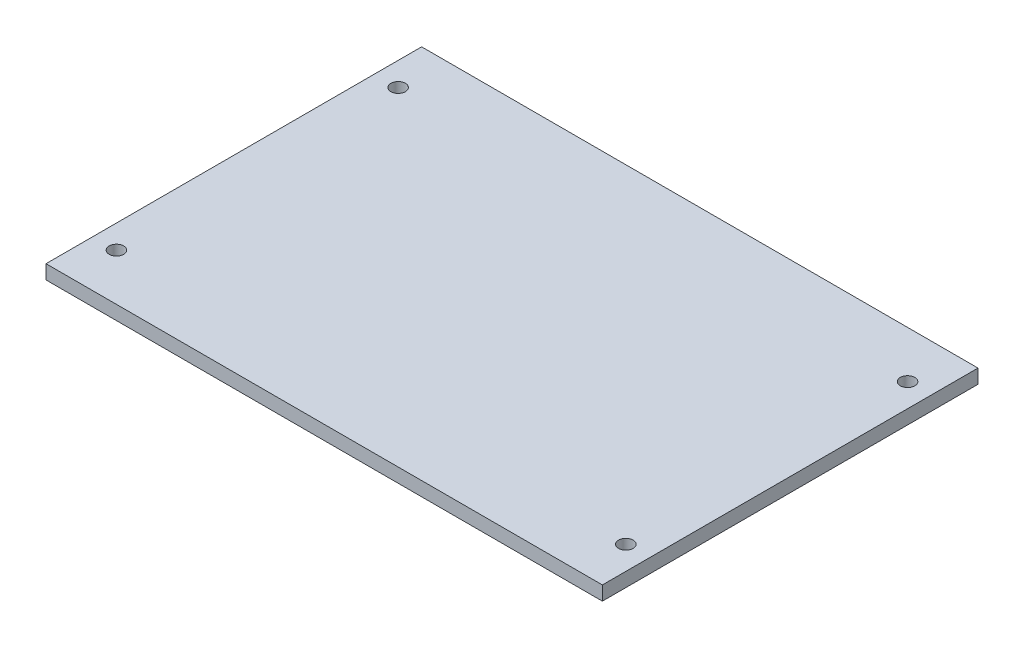
ISO-10303-21;
HEADER;
FILE_DESCRIPTION(('STEP AP214'),'2;1');
FILE_NAME('part.step','',(''),(''),'','','');
FILE_SCHEMA(('AUTOMOTIVE_DESIGN { 1 0 10303 214 1 1 1 1 }'));
ENDSEC;
DATA;
#1=APPLICATION_CONTEXT('core data for automotive mechanical design processes');
#2=APPLICATION_PROTOCOL_DEFINITION('international standard','automotive_design',2000,#1);
#3=PRODUCT_CONTEXT('',#1,'mechanical');
#4=PRODUCT('Part','Part','',(#3));
#5=PRODUCT_RELATED_PRODUCT_CATEGORY('part','',(#4));
#6=PRODUCT_DEFINITION_FORMATION('','',#4);
#7=PRODUCT_DEFINITION_CONTEXT('part definition',#1,'design');
#8=PRODUCT_DEFINITION('design','',#6,#7);
#9=PRODUCT_DEFINITION_SHAPE('','',#8);
#10=(LENGTH_UNIT() NAMED_UNIT(*) SI_UNIT(.MILLI.,.METRE.));
#11=(NAMED_UNIT(*) PLANE_ANGLE_UNIT() SI_UNIT($,.RADIAN.));
#12=(NAMED_UNIT(*) SI_UNIT($,.STERADIAN.) SOLID_ANGLE_UNIT());
#13=UNCERTAINTY_MEASURE_WITH_UNIT(LENGTH_MEASURE(1.E-05),#10,'distance_accuracy_value','');
#14=(GEOMETRIC_REPRESENTATION_CONTEXT(3) GLOBAL_UNCERTAINTY_ASSIGNED_CONTEXT((#13)) GLOBAL_UNIT_ASSIGNED_CONTEXT((#10,
#11,#12)) REPRESENTATION_CONTEXT('',''));
#15=CARTESIAN_POINT('',(0.,0.,0.));
#16=DIRECTION('',(0.,0.,1.));
#17=DIRECTION('',(1.,0.,0.));
#18=AXIS2_PLACEMENT_3D('',#15,#16,#17);
#19=CARTESIAN_POINT('',(0.,0.,80.));
#20=DIRECTION('',(1.,0.,0.));
#21=DIRECTION('',(0.,0.,-1.));
#22=AXIS2_PLACEMENT_3D('',#19,#20,#21);
#23=PLANE('',#22);
#24=DIRECTION('',(0.,-1.,0.));
#25=VECTOR('',#24,1.);
#26=CARTESIAN_POINT('',(0.,0.,0.));
#27=LINE('',#26,#25);
#28=CARTESIAN_POINT('',(0.,3.,0.));
#29=VERTEX_POINT('',#28);
#30=CARTESIAN_POINT('',(0.,0.,0.));
#31=VERTEX_POINT('',#30);
#32=EDGE_CURVE('E104',#29,#31,#27,.T.);
#33=ORIENTED_EDGE('',*,*,#32,.T.);
#34=DIRECTION('',(0.,0.,-1.));
#35=VECTOR('',#34,1.);
#36=CARTESIAN_POINT('',(0.,0.,80.));
#37=LINE('',#36,#35);
#38=CARTESIAN_POINT('',(0.,0.,80.));
#39=VERTEX_POINT('',#38);
#40=EDGE_CURVE('E11',#39,#31,#37,.T.);
#41=ORIENTED_EDGE('',*,*,#40,.F.);
#42=DIRECTION('',(0.,-1.,0.));
#43=VECTOR('',#42,1.);
#44=CARTESIAN_POINT('',(0.,0.,80.));
#45=LINE('',#44,#43);
#46=CARTESIAN_POINT('',(0.,3.,80.));
#47=VERTEX_POINT('',#46);
#48=EDGE_CURVE('E92',#47,#39,#45,.T.);
#49=ORIENTED_EDGE('',*,*,#48,.F.);
#50=DIRECTION('',(0.,0.,-1.));
#51=VECTOR('',#50,1.);
#52=CARTESIAN_POINT('',(0.,3.,80.));
#53=LINE('',#52,#51);
#54=EDGE_CURVE('E100',#47,#29,#53,.T.);
#55=ORIENTED_EDGE('',*,*,#54,.T.);
#56=EDGE_LOOP('',(#33,#41,#49,#55));
#57=FACE_BOUND('',#56,.T.);
#58=ADVANCED_FACE('F41',(#57),#23,.F.);
#59=CARTESIAN_POINT('',(0.,0.,80.));
#60=DIRECTION('',(0.,1.,0.));
#61=DIRECTION('',(0.,0.,1.));
#62=AXIS2_PLACEMENT_3D('',#59,#60,#61);
#63=PLANE('',#62);
#64=CARTESIAN_POINT('',(113.5,0.,9.99999999999998));
#65=DIRECTION('',(0.,1.,0.));
#66=DIRECTION('',(0.,0.,1.));
#67=AXIS2_PLACEMENT_3D('',#64,#65,#66);
#68=CIRCLE('',#67,1.54999999999999);
#69=CARTESIAN_POINT('',(113.5,0.,11.55));
#70=VERTEX_POINT('',#69);
#71=EDGE_CURVE('E128',#70,#70,#68,.F.);
#72=ORIENTED_EDGE('',*,*,#71,.F.);
#73=EDGE_LOOP('',(#72));
#74=FACE_BOUND('',#73,.T.);
#75=CARTESIAN_POINT('',(113.5,0.,70.));
#76=DIRECTION('',(0.,1.,0.));
#77=DIRECTION('',(0.,0.,1.));
#78=AXIS2_PLACEMENT_3D('',#75,#76,#77);
#79=CIRCLE('',#78,1.54999999999999);
#80=CARTESIAN_POINT('',(113.5,0.,71.55));
#81=VERTEX_POINT('',#80);
#82=EDGE_CURVE('E127',#81,#81,#79,.F.);
#83=ORIENTED_EDGE('',*,*,#82,.F.);
#84=EDGE_LOOP('',(#83));
#85=FACE_BOUND('',#84,.T.);
#86=CARTESIAN_POINT('',(5.00000000000001,0.,70.));
#87=DIRECTION('',(0.,1.,0.));
#88=DIRECTION('',(0.,0.,1.));
#89=AXIS2_PLACEMENT_3D('',#86,#87,#88);
#90=CIRCLE('',#89,1.55);
#91=CARTESIAN_POINT('',(5.00000000000001,0.,71.55));
#92=VERTEX_POINT('',#91);
#93=EDGE_CURVE('E134',#92,#92,#90,.F.);
#94=ORIENTED_EDGE('',*,*,#93,.F.);
#95=EDGE_LOOP('',(#94));
#96=FACE_BOUND('',#95,.T.);
#97=CARTESIAN_POINT('',(5.,0.,10.));
#98=DIRECTION('',(0.,1.,0.));
#99=DIRECTION('',(0.,0.,1.));
#100=AXIS2_PLACEMENT_3D('',#97,#98,#99);
#101=CIRCLE('',#100,1.55);
#102=CARTESIAN_POINT('',(5.,0.,11.55));
#103=VERTEX_POINT('',#102);
#104=EDGE_CURVE('E107',#103,#103,#101,.F.);
#105=ORIENTED_EDGE('',*,*,#104,.F.);
#106=EDGE_LOOP('',(#105));
#107=FACE_BOUND('',#106,.T.);
#108=DIRECTION('',(1.,0.,0.));
#109=VECTOR('',#108,1.);
#110=CARTESIAN_POINT('',(0.,0.,0.));
#111=LINE('',#110,#109);
#112=CARTESIAN_POINT('',(118.5,0.,0.));
#113=VERTEX_POINT('',#112);
#114=EDGE_CURVE('E96',#31,#113,#111,.T.);
#115=ORIENTED_EDGE('',*,*,#114,.T.);
#116=DIRECTION('',(0.,0.,-1.));
#117=VECTOR('',#116,1.);
#118=CARTESIAN_POINT('',(118.5,0.,80.));
#119=LINE('',#118,#117);
#120=CARTESIAN_POINT('',(118.5,0.,80.));
#121=VERTEX_POINT('',#120);
#122=EDGE_CURVE('E49',#121,#113,#119,.T.);
#123=ORIENTED_EDGE('',*,*,#122,.F.);
#124=DIRECTION('',(1.,0.,0.));
#125=VECTOR('',#124,1.);
#126=CARTESIAN_POINT('',(0.,0.,80.));
#127=LINE('',#126,#125);
#128=EDGE_CURVE('E87',#39,#121,#127,.T.);
#129=ORIENTED_EDGE('',*,*,#128,.F.);
#130=ORIENTED_EDGE('',*,*,#40,.T.);
#131=EDGE_LOOP('',(#115,#123,#129,#130));
#132=FACE_BOUND('',#131,.T.);
#133=ADVANCED_FACE('F95',(#74,#85,#96,#107,#132),#63,.F.);
#134=CARTESIAN_POINT('',(118.5,0.,80.));
#135=DIRECTION('',(-1.,0.,0.));
#136=DIRECTION('',(0.,0.,1.));
#137=AXIS2_PLACEMENT_3D('',#134,#135,#136);
#138=PLANE('',#137);
#139=DIRECTION('',(0.,1.,0.));
#140=VECTOR('',#139,1.);
#141=CARTESIAN_POINT('',(118.5,0.,0.));
#142=LINE('',#141,#140);
#143=CARTESIAN_POINT('',(118.5,3.,0.));
#144=VERTEX_POINT('',#143);
#145=EDGE_CURVE('E74',#113,#144,#142,.T.);
#146=ORIENTED_EDGE('',*,*,#145,.T.);
#147=DIRECTION('',(0.,0.,-1.));
#148=VECTOR('',#147,1.);
#149=CARTESIAN_POINT('',(118.5,3.,80.));
#150=LINE('',#149,#148);
#151=CARTESIAN_POINT('',(118.5,3.,80.));
#152=VERTEX_POINT('',#151);
#153=EDGE_CURVE('E97',#152,#144,#150,.T.);
#154=ORIENTED_EDGE('',*,*,#153,.F.);
#155=DIRECTION('',(0.,1.,0.));
#156=VECTOR('',#155,1.);
#157=CARTESIAN_POINT('',(118.5,0.,80.));
#158=LINE('',#157,#156);
#159=EDGE_CURVE('E90',#121,#152,#158,.T.);
#160=ORIENTED_EDGE('',*,*,#159,.F.);
#161=ORIENTED_EDGE('',*,*,#122,.T.);
#162=EDGE_LOOP('',(#146,#154,#160,#161));
#163=FACE_BOUND('',#162,.T.);
#164=ADVANCED_FACE('F98',(#163),#138,.F.);
#165=CARTESIAN_POINT('',(0.,3.,80.));
#166=DIRECTION('',(0.,-1.,0.));
#167=DIRECTION('',(0.,0.,-1.));
#168=AXIS2_PLACEMENT_3D('',#165,#166,#167);
#169=PLANE('',#168);
#170=CARTESIAN_POINT('',(113.5,3.,9.99999999999998));
#171=DIRECTION('',(0.,1.,0.));
#172=DIRECTION('',(0.,0.,-1.));
#173=AXIS2_PLACEMENT_3D('',#170,#171,#172);
#174=CIRCLE('',#173,1.54999999999999);
#175=CARTESIAN_POINT('',(113.5,3.,11.55));
#176=VERTEX_POINT('',#175);
#177=EDGE_CURVE('E124',#176,#176,#174,.T.);
#178=ORIENTED_EDGE('',*,*,#177,.F.);
#179=EDGE_LOOP('',(#178));
#180=FACE_BOUND('',#179,.T.);
#181=CARTESIAN_POINT('',(113.5,3.,70.));
#182=DIRECTION('',(0.,1.,0.));
#183=DIRECTION('',(0.,0.,1.));
#184=AXIS2_PLACEMENT_3D('',#181,#182,#183);
#185=CIRCLE('',#184,1.54999999999999);
#186=CARTESIAN_POINT('',(113.5,3.,71.55));
#187=VERTEX_POINT('',#186);
#188=EDGE_CURVE('E131',#187,#187,#185,.T.);
#189=ORIENTED_EDGE('',*,*,#188,.F.);
#190=EDGE_LOOP('',(#189));
#191=FACE_BOUND('',#190,.T.);
#192=CARTESIAN_POINT('',(5.00000000000001,3.,70.));
#193=DIRECTION('',(0.,1.,0.));
#194=DIRECTION('',(0.,0.,-1.));
#195=AXIS2_PLACEMENT_3D('',#192,#193,#194);
#196=CIRCLE('',#195,1.55);
#197=CARTESIAN_POINT('',(5.00000000000001,3.,71.55));
#198=VERTEX_POINT('',#197);
#199=EDGE_CURVE('E123',#198,#198,#196,.T.);
#200=ORIENTED_EDGE('',*,*,#199,.F.);
#201=EDGE_LOOP('',(#200));
#202=FACE_BOUND('',#201,.T.);
#203=CARTESIAN_POINT('',(5.,3.,10.));
#204=DIRECTION('',(0.,1.,0.));
#205=DIRECTION('',(0.,0.,1.));
#206=AXIS2_PLACEMENT_3D('',#203,#204,#205);
#207=CIRCLE('',#206,1.55);
#208=CARTESIAN_POINT('',(5.,3.,11.55));
#209=VERTEX_POINT('',#208);
#210=EDGE_CURVE('E120',#209,#209,#207,.T.);
#211=ORIENTED_EDGE('',*,*,#210,.F.);
#212=EDGE_LOOP('',(#211));
#213=FACE_BOUND('',#212,.T.);
#214=DIRECTION('',(-1.,0.,0.));
#215=VECTOR('',#214,1.);
#216=CARTESIAN_POINT('',(0.,3.,0.));
#217=LINE('',#216,#215);
#218=EDGE_CURVE('E80',#144,#29,#217,.T.);
#219=ORIENTED_EDGE('',*,*,#218,.T.);
#220=ORIENTED_EDGE('',*,*,#54,.F.);
#221=DIRECTION('',(-1.,0.,0.));
#222=VECTOR('',#221,1.);
#223=CARTESIAN_POINT('',(0.,3.,80.));
#224=LINE('',#223,#222);
#225=EDGE_CURVE('E57',#152,#47,#224,.T.);
#226=ORIENTED_EDGE('',*,*,#225,.F.);
#227=ORIENTED_EDGE('',*,*,#153,.T.);
#228=EDGE_LOOP('',(#219,#220,#226,#227));
#229=FACE_BOUND('',#228,.T.);
#230=ADVANCED_FACE('F112',(#180,#191,#202,#213,#229),#169,.F.);
#231=CARTESIAN_POINT('',(0.,0.,80.));
#232=DIRECTION('',(0.,0.,-1.));
#233=DIRECTION('',(-1.,0.,0.));
#234=AXIS2_PLACEMENT_3D('',#231,#232,#233);
#235=PLANE('',#234);
#236=ORIENTED_EDGE('',*,*,#48,.T.);
#237=ORIENTED_EDGE('',*,*,#128,.T.);
#238=ORIENTED_EDGE('',*,*,#159,.T.);
#239=ORIENTED_EDGE('',*,*,#225,.T.);
#240=EDGE_LOOP('',(#236,#237,#238,#239));
#241=FACE_BOUND('',#240,.T.);
#242=ADVANCED_FACE('F88',(#241),#235,.F.);
#243=CARTESIAN_POINT('',(0.,0.,0.));
#244=DIRECTION('',(0.,0.,-1.));
#245=DIRECTION('',(-1.,0.,0.));
#246=AXIS2_PLACEMENT_3D('',#243,#244,#245);
#247=PLANE('',#246);
#248=ORIENTED_EDGE('',*,*,#32,.F.);
#249=ORIENTED_EDGE('',*,*,#218,.F.);
#250=ORIENTED_EDGE('',*,*,#145,.F.);
#251=ORIENTED_EDGE('',*,*,#114,.F.);
#252=EDGE_LOOP('',(#248,#249,#250,#251));
#253=FACE_BOUND('',#252,.T.);
#254=ADVANCED_FACE('F115',(#253),#247,.T.);
#255=CARTESIAN_POINT('',(5.,-0.00100000000000013,10.));
#256=DIRECTION('',(0.,1.,0.));
#257=DIRECTION('',(0.,0.,1.));
#258=AXIS2_PLACEMENT_3D('',#255,#256,#257);
#259=CYLINDRICAL_SURFACE('',#258,1.55);
#260=CARTESIAN_POINT('',(5.,3.,11.55));
#261=CARTESIAN_POINT('',(5.,2.96875,11.55));
#262=CARTESIAN_POINT('',(5.,2.9375,11.55));
#263=CARTESIAN_POINT('',(5.,2.875,11.55));
#264=CARTESIAN_POINT('',(5.,2.84375,11.55));
#265=CARTESIAN_POINT('',(5.,2.78125,11.55));
#266=CARTESIAN_POINT('',(5.,2.75,11.55));
#267=CARTESIAN_POINT('',(5.,2.6875,11.55));
#268=CARTESIAN_POINT('',(5.,2.65625,11.55));
#269=CARTESIAN_POINT('',(5.,2.59375,11.55));
#270=CARTESIAN_POINT('',(5.,2.5625,11.55));
#271=CARTESIAN_POINT('',(5.,2.5,11.55));
#272=CARTESIAN_POINT('',(5.,2.46875,11.55));
#273=CARTESIAN_POINT('',(5.,2.40625,11.55));
#274=CARTESIAN_POINT('',(5.,2.375,11.55));
#275=CARTESIAN_POINT('',(5.,2.3125,11.55));
#276=CARTESIAN_POINT('',(5.,2.28125,11.55));
#277=CARTESIAN_POINT('',(5.,2.21875,11.55));
#278=CARTESIAN_POINT('',(5.,2.1875,11.55));
#279=CARTESIAN_POINT('',(5.,2.125,11.55));
#280=CARTESIAN_POINT('',(5.,2.09375,11.55));
#281=CARTESIAN_POINT('',(5.,2.03125,11.55));
#282=CARTESIAN_POINT('',(5.,2.,11.55));
#283=CARTESIAN_POINT('',(5.,1.9375,11.55));
#284=CARTESIAN_POINT('',(5.,1.90625,11.55));
#285=CARTESIAN_POINT('',(5.,1.84375,11.55));
#286=CARTESIAN_POINT('',(5.,1.8125,11.55));
#287=CARTESIAN_POINT('',(5.,1.75,11.55));
#288=CARTESIAN_POINT('',(5.,1.71875,11.55));
#289=CARTESIAN_POINT('',(5.,1.65625,11.55));
#290=CARTESIAN_POINT('',(5.,1.625,11.55));
#291=CARTESIAN_POINT('',(5.,1.5625,11.55));
#292=CARTESIAN_POINT('',(5.,1.53125,11.55));
#293=CARTESIAN_POINT('',(5.,1.46875,11.55));
#294=CARTESIAN_POINT('',(5.,1.4375,11.55));
#295=CARTESIAN_POINT('',(5.,1.375,11.55));
#296=CARTESIAN_POINT('',(5.,1.34375,11.55));
#297=CARTESIAN_POINT('',(5.,1.28125,11.55));
#298=CARTESIAN_POINT('',(5.,1.25,11.55));
#299=CARTESIAN_POINT('',(5.,1.1875,11.55));
#300=CARTESIAN_POINT('',(5.,1.15625,11.55));
#301=CARTESIAN_POINT('',(5.,1.09375,11.55));
#302=CARTESIAN_POINT('',(5.,1.0625,11.55));
#303=CARTESIAN_POINT('',(5.,1.,11.55));
#304=CARTESIAN_POINT('',(5.,0.96875,11.55));
#305=CARTESIAN_POINT('',(5.,0.90625,11.55));
#306=CARTESIAN_POINT('',(5.,0.875,11.55));
#307=CARTESIAN_POINT('',(5.,0.8125,11.55));
#308=CARTESIAN_POINT('',(5.,0.78125,11.55));
#309=CARTESIAN_POINT('',(5.,0.71875,11.55));
#310=CARTESIAN_POINT('',(5.,0.6875,11.55));
#311=CARTESIAN_POINT('',(5.,0.625,11.55));
#312=CARTESIAN_POINT('',(5.,0.59375,11.55));
#313=CARTESIAN_POINT('',(5.,0.53125,11.55));
#314=CARTESIAN_POINT('',(5.,0.5,11.55));
#315=CARTESIAN_POINT('',(5.,0.4375,11.55));
#316=CARTESIAN_POINT('',(5.,0.40625,11.55));
#317=CARTESIAN_POINT('',(5.,0.34375,11.55));
#318=CARTESIAN_POINT('',(5.,0.3125,11.55));
#319=CARTESIAN_POINT('',(5.,0.25,11.55));
#320=CARTESIAN_POINT('',(5.,0.21875,11.55));
#321=CARTESIAN_POINT('',(5.,0.15625,11.55));
#322=CARTESIAN_POINT('',(5.,0.125,11.55));
#323=CARTESIAN_POINT('',(5.,0.0625000000000001,11.55));
#324=CARTESIAN_POINT('',(5.,0.0312500000000001,11.55));
#325=CARTESIAN_POINT('',(5.,0.,11.55));
#326=B_SPLINE_CURVE_WITH_KNOTS('',3,(#260,#261,#262,#263,#264,#265,#266,#267,#268,#269,#270,
#271,#272,#273,#274,#275,#276,#277,#278,#279,#280,#281,#282,#283,#284,#285,#286,#287,#288,#289,
#290,#291,#292,#293,#294,#295,#296,#297,#298,#299,#300,#301,#302,#303,#304,#305,#306,#307,#308,
#309,#310,#311,#312,#313,#314,#315,#316,#317,#318,#319,#320,#321,#322,#323,#324,#325),
.UNSPECIFIED.,.F.,.F.,(4,2,2,2,2,2,2,2,2,2,2,2,2,2,2,2,2,2,2,2,2,2,2,2,2,2,2,2,2,2,2,2,4),(0.,
0.0937500000000001,0.1875,0.28125,0.375,0.46875,0.5625,0.65625,0.75,0.84375,0.9375,1.03125,
1.125,1.21875,1.3125,1.40625,1.5,1.59375,1.6875,1.78125,1.875,1.96875,2.0625,2.15625,2.25,
2.34375,2.4375,2.53125,2.625,2.71875,2.8125,2.90625,3.),.UNSPECIFIED.);
#327=EDGE_CURVE('BSEAM149',#209,#103,#326,.T.);
#328=ORIENTED_EDGE('',*,*,#210,.T.);
#329=ORIENTED_EDGE('',*,*,#104,.T.);
#330=ORIENTED_EDGE('',*,*,#327,.T.);
#331=ORIENTED_EDGE('',*,*,#327,.F.);
#332=EDGE_LOOP('',(#328,#330,#329,#331));
#333=FACE_BOUND('',#332,.T.);
#334=ADVANCED_FACE('F149',(#333),#259,.F.);
#335=CARTESIAN_POINT('',(5.00000000000001,-0.00100000000000013,70.));
#336=DIRECTION('',(0.,1.,0.));
#337=DIRECTION('',(0.,0.,1.));
#338=AXIS2_PLACEMENT_3D('',#335,#336,#337);
#339=CYLINDRICAL_SURFACE('',#338,1.55);
#340=CARTESIAN_POINT('',(5.00000000000001,3.,71.55));
#341=CARTESIAN_POINT('',(5.00000000000001,2.96875,71.55));
#342=CARTESIAN_POINT('',(5.00000000000001,2.9375,71.55));
#343=CARTESIAN_POINT('',(5.00000000000001,2.875,71.55));
#344=CARTESIAN_POINT('',(5.00000000000001,2.84375,71.55));
#345=CARTESIAN_POINT('',(5.00000000000001,2.78125,71.55));
#346=CARTESIAN_POINT('',(5.00000000000001,2.75,71.55));
#347=CARTESIAN_POINT('',(5.00000000000001,2.6875,71.55));
#348=CARTESIAN_POINT('',(5.00000000000001,2.65625,71.55));
#349=CARTESIAN_POINT('',(5.00000000000001,2.59375,71.55));
#350=CARTESIAN_POINT('',(5.00000000000001,2.5625,71.55));
#351=CARTESIAN_POINT('',(5.00000000000001,2.5,71.55));
#352=CARTESIAN_POINT('',(5.00000000000001,2.46875,71.55));
#353=CARTESIAN_POINT('',(5.00000000000001,2.40625,71.55));
#354=CARTESIAN_POINT('',(5.00000000000001,2.375,71.55));
#355=CARTESIAN_POINT('',(5.00000000000001,2.3125,71.55));
#356=CARTESIAN_POINT('',(5.00000000000001,2.28125,71.55));
#357=CARTESIAN_POINT('',(5.00000000000001,2.21875,71.55));
#358=CARTESIAN_POINT('',(5.00000000000001,2.1875,71.55));
#359=CARTESIAN_POINT('',(5.00000000000001,2.125,71.55));
#360=CARTESIAN_POINT('',(5.00000000000001,2.09375,71.55));
#361=CARTESIAN_POINT('',(5.00000000000001,2.03125,71.55));
#362=CARTESIAN_POINT('',(5.00000000000001,2.,71.55));
#363=CARTESIAN_POINT('',(5.00000000000001,1.9375,71.55));
#364=CARTESIAN_POINT('',(5.00000000000001,1.90625,71.55));
#365=CARTESIAN_POINT('',(5.00000000000001,1.84375,71.55));
#366=CARTESIAN_POINT('',(5.00000000000001,1.8125,71.55));
#367=CARTESIAN_POINT('',(5.00000000000001,1.75,71.55));
#368=CARTESIAN_POINT('',(5.00000000000001,1.71875,71.55));
#369=CARTESIAN_POINT('',(5.00000000000001,1.65625,71.55));
#370=CARTESIAN_POINT('',(5.00000000000001,1.625,71.55));
#371=CARTESIAN_POINT('',(5.00000000000001,1.5625,71.55));
#372=CARTESIAN_POINT('',(5.00000000000001,1.53125,71.55));
#373=CARTESIAN_POINT('',(5.00000000000001,1.46875,71.55));
#374=CARTESIAN_POINT('',(5.00000000000001,1.4375,71.55));
#375=CARTESIAN_POINT('',(5.00000000000001,1.375,71.55));
#376=CARTESIAN_POINT('',(5.00000000000001,1.34375,71.55));
#377=CARTESIAN_POINT('',(5.00000000000001,1.28125,71.55));
#378=CARTESIAN_POINT('',(5.00000000000001,1.25,71.55));
#379=CARTESIAN_POINT('',(5.00000000000001,1.1875,71.55));
#380=CARTESIAN_POINT('',(5.00000000000001,1.15625,71.55));
#381=CARTESIAN_POINT('',(5.00000000000001,1.09375,71.55));
#382=CARTESIAN_POINT('',(5.00000000000001,1.0625,71.55));
#383=CARTESIAN_POINT('',(5.00000000000001,1.,71.55));
#384=CARTESIAN_POINT('',(5.00000000000001,0.96875,71.55));
#385=CARTESIAN_POINT('',(5.00000000000001,0.90625,71.55));
#386=CARTESIAN_POINT('',(5.00000000000001,0.875,71.55));
#387=CARTESIAN_POINT('',(5.00000000000001,0.8125,71.55));
#388=CARTESIAN_POINT('',(5.00000000000001,0.78125,71.55));
#389=CARTESIAN_POINT('',(5.00000000000001,0.71875,71.55));
#390=CARTESIAN_POINT('',(5.00000000000001,0.6875,71.55));
#391=CARTESIAN_POINT('',(5.00000000000001,0.625,71.55));
#392=CARTESIAN_POINT('',(5.00000000000001,0.59375,71.55));
#393=CARTESIAN_POINT('',(5.00000000000001,0.53125,71.55));
#394=CARTESIAN_POINT('',(5.00000000000001,0.5,71.55));
#395=CARTESIAN_POINT('',(5.00000000000001,0.4375,71.55));
#396=CARTESIAN_POINT('',(5.00000000000001,0.40625,71.55));
#397=CARTESIAN_POINT('',(5.00000000000001,0.34375,71.55));
#398=CARTESIAN_POINT('',(5.00000000000001,0.3125,71.55));
#399=CARTESIAN_POINT('',(5.00000000000001,0.25,71.55));
#400=CARTESIAN_POINT('',(5.00000000000001,0.21875,71.55));
#401=CARTESIAN_POINT('',(5.00000000000001,0.15625,71.55));
#402=CARTESIAN_POINT('',(5.00000000000001,0.125,71.55));
#403=CARTESIAN_POINT('',(5.00000000000001,0.0625000000000001,71.55));
#404=CARTESIAN_POINT('',(5.00000000000001,0.0312500000000001,71.55));
#405=CARTESIAN_POINT('',(5.00000000000001,0.,71.55));
#406=B_SPLINE_CURVE_WITH_KNOTS('',3,(#340,#341,#342,#343,#344,#345,#346,#347,#348,#349,#350,
#351,#352,#353,#354,#355,#356,#357,#358,#359,#360,#361,#362,#363,#364,#365,#366,#367,#368,#369,
#370,#371,#372,#373,#374,#375,#376,#377,#378,#379,#380,#381,#382,#383,#384,#385,#386,#387,#388,
#389,#390,#391,#392,#393,#394,#395,#396,#397,#398,#399,#400,#401,#402,#403,#404,#405),
.UNSPECIFIED.,.F.,.F.,(4,2,2,2,2,2,2,2,2,2,2,2,2,2,2,2,2,2,2,2,2,2,2,2,2,2,2,2,2,2,2,2,4),(0.,
0.0937500000000001,0.1875,0.28125,0.375,0.46875,0.5625,0.65625,0.75,0.84375,0.9375,1.03125,
1.125,1.21875,1.3125,1.40625,1.5,1.59375,1.6875,1.78125,1.875,1.96875,2.0625,2.15625,2.25,
2.34375,2.4375,2.53125,2.625,2.71875,2.8125,2.90625,3.),.UNSPECIFIED.);
#407=EDGE_CURVE('BSEAM142',#198,#92,#406,.T.);
#408=ORIENTED_EDGE('',*,*,#199,.T.);
#409=ORIENTED_EDGE('',*,*,#93,.T.);
#410=ORIENTED_EDGE('',*,*,#407,.T.);
#411=ORIENTED_EDGE('',*,*,#407,.F.);
#412=EDGE_LOOP('',(#408,#410,#409,#411));
#413=FACE_BOUND('',#412,.T.);
#414=ADVANCED_FACE('F142',(#413),#339,.F.);
#415=CARTESIAN_POINT('',(113.5,-0.00100000000000013,70.));
#416=DIRECTION('',(0.,1.,0.));
#417=DIRECTION('',(0.,0.,1.));
#418=AXIS2_PLACEMENT_3D('',#415,#416,#417);
#419=CYLINDRICAL_SURFACE('',#418,1.54999999999999);
#420=CARTESIAN_POINT('',(113.5,3.,71.55));
#421=CARTESIAN_POINT('',(113.5,2.96875,71.55));
#422=CARTESIAN_POINT('',(113.5,2.9375,71.55));
#423=CARTESIAN_POINT('',(113.5,2.875,71.55));
#424=CARTESIAN_POINT('',(113.5,2.84375,71.55));
#425=CARTESIAN_POINT('',(113.5,2.78125,71.55));
#426=CARTESIAN_POINT('',(113.5,2.75,71.55));
#427=CARTESIAN_POINT('',(113.5,2.6875,71.55));
#428=CARTESIAN_POINT('',(113.5,2.65625,71.55));
#429=CARTESIAN_POINT('',(113.5,2.59375,71.55));
#430=CARTESIAN_POINT('',(113.5,2.5625,71.55));
#431=CARTESIAN_POINT('',(113.5,2.5,71.55));
#432=CARTESIAN_POINT('',(113.5,2.46875,71.55));
#433=CARTESIAN_POINT('',(113.5,2.40625,71.55));
#434=CARTESIAN_POINT('',(113.5,2.375,71.55));
#435=CARTESIAN_POINT('',(113.5,2.3125,71.55));
#436=CARTESIAN_POINT('',(113.5,2.28125,71.55));
#437=CARTESIAN_POINT('',(113.5,2.21875,71.55));
#438=CARTESIAN_POINT('',(113.5,2.1875,71.55));
#439=CARTESIAN_POINT('',(113.5,2.125,71.55));
#440=CARTESIAN_POINT('',(113.5,2.09375,71.55));
#441=CARTESIAN_POINT('',(113.5,2.03125,71.55));
#442=CARTESIAN_POINT('',(113.5,2.,71.55));
#443=CARTESIAN_POINT('',(113.5,1.9375,71.55));
#444=CARTESIAN_POINT('',(113.5,1.90625,71.55));
#445=CARTESIAN_POINT('',(113.5,1.84375,71.55));
#446=CARTESIAN_POINT('',(113.5,1.8125,71.55));
#447=CARTESIAN_POINT('',(113.5,1.75,71.55));
#448=CARTESIAN_POINT('',(113.5,1.71875,71.55));
#449=CARTESIAN_POINT('',(113.5,1.65625,71.55));
#450=CARTESIAN_POINT('',(113.5,1.625,71.55));
#451=CARTESIAN_POINT('',(113.5,1.5625,71.55));
#452=CARTESIAN_POINT('',(113.5,1.53125,71.55));
#453=CARTESIAN_POINT('',(113.5,1.46875,71.55));
#454=CARTESIAN_POINT('',(113.5,1.4375,71.55));
#455=CARTESIAN_POINT('',(113.5,1.375,71.55));
#456=CARTESIAN_POINT('',(113.5,1.34375,71.55));
#457=CARTESIAN_POINT('',(113.5,1.28125,71.55));
#458=CARTESIAN_POINT('',(113.5,1.25,71.55));
#459=CARTESIAN_POINT('',(113.5,1.1875,71.55));
#460=CARTESIAN_POINT('',(113.5,1.15625,71.55));
#461=CARTESIAN_POINT('',(113.5,1.09375,71.55));
#462=CARTESIAN_POINT('',(113.5,1.0625,71.55));
#463=CARTESIAN_POINT('',(113.5,1.,71.55));
#464=CARTESIAN_POINT('',(113.5,0.96875,71.55));
#465=CARTESIAN_POINT('',(113.5,0.90625,71.55));
#466=CARTESIAN_POINT('',(113.5,0.875,71.55));
#467=CARTESIAN_POINT('',(113.5,0.8125,71.55));
#468=CARTESIAN_POINT('',(113.5,0.78125,71.55));
#469=CARTESIAN_POINT('',(113.5,0.71875,71.55));
#470=CARTESIAN_POINT('',(113.5,0.6875,71.55));
#471=CARTESIAN_POINT('',(113.5,0.625,71.55));
#472=CARTESIAN_POINT('',(113.5,0.59375,71.55));
#473=CARTESIAN_POINT('',(113.5,0.53125,71.55));
#474=CARTESIAN_POINT('',(113.5,0.5,71.55));
#475=CARTESIAN_POINT('',(113.5,0.4375,71.55));
#476=CARTESIAN_POINT('',(113.5,0.40625,71.55));
#477=CARTESIAN_POINT('',(113.5,0.34375,71.55));
#478=CARTESIAN_POINT('',(113.5,0.3125,71.55));
#479=CARTESIAN_POINT('',(113.5,0.25,71.55));
#480=CARTESIAN_POINT('',(113.5,0.21875,71.55));
#481=CARTESIAN_POINT('',(113.5,0.15625,71.55));
#482=CARTESIAN_POINT('',(113.5,0.125,71.55));
#483=CARTESIAN_POINT('',(113.5,0.0625000000000001,71.55));
#484=CARTESIAN_POINT('',(113.5,0.0312500000000001,71.55));
#485=CARTESIAN_POINT('',(113.5,0.,71.55));
#486=B_SPLINE_CURVE_WITH_KNOTS('',3,(#420,#421,#422,#423,#424,#425,#426,#427,#428,#429,#430,
#431,#432,#433,#434,#435,#436,#437,#438,#439,#440,#441,#442,#443,#444,#445,#446,#447,#448,#449,
#450,#451,#452,#453,#454,#455,#456,#457,#458,#459,#460,#461,#462,#463,#464,#465,#466,#467,#468,
#469,#470,#471,#472,#473,#474,#475,#476,#477,#478,#479,#480,#481,#482,#483,#484,#485),
.UNSPECIFIED.,.F.,.F.,(4,2,2,2,2,2,2,2,2,2,2,2,2,2,2,2,2,2,2,2,2,2,2,2,2,2,2,2,2,2,2,2,4),(0.,
0.0937500000000001,0.1875,0.28125,0.375,0.46875,0.5625,0.65625,0.75,0.84375,0.9375,1.03125,
1.125,1.21875,1.3125,1.40625,1.5,1.59375,1.6875,1.78125,1.875,1.96875,2.0625,2.15625,2.25,
2.34375,2.4375,2.53125,2.625,2.71875,2.8125,2.90625,3.),.UNSPECIFIED.);
#487=EDGE_CURVE('BSEAM157',#187,#81,#486,.T.);
#488=ORIENTED_EDGE('',*,*,#188,.T.);
#489=ORIENTED_EDGE('',*,*,#82,.T.);
#490=ORIENTED_EDGE('',*,*,#487,.T.);
#491=ORIENTED_EDGE('',*,*,#487,.F.);
#492=EDGE_LOOP('',(#488,#490,#489,#491));
#493=FACE_BOUND('',#492,.T.);
#494=ADVANCED_FACE('F157',(#493),#419,.F.);
#495=CARTESIAN_POINT('',(113.5,-0.00100000000000013,9.99999999999998));
#496=DIRECTION('',(0.,1.,0.));
#497=DIRECTION('',(0.,0.,1.));
#498=AXIS2_PLACEMENT_3D('',#495,#496,#497);
#499=CYLINDRICAL_SURFACE('',#498,1.54999999999999);
#500=CARTESIAN_POINT('',(113.5,3.,11.55));
#501=CARTESIAN_POINT('',(113.5,2.96875,11.55));
#502=CARTESIAN_POINT('',(113.5,2.9375,11.55));
#503=CARTESIAN_POINT('',(113.5,2.875,11.55));
#504=CARTESIAN_POINT('',(113.5,2.84375,11.55));
#505=CARTESIAN_POINT('',(113.5,2.78125,11.55));
#506=CARTESIAN_POINT('',(113.5,2.75,11.55));
#507=CARTESIAN_POINT('',(113.5,2.6875,11.55));
#508=CARTESIAN_POINT('',(113.5,2.65625,11.55));
#509=CARTESIAN_POINT('',(113.5,2.59375,11.55));
#510=CARTESIAN_POINT('',(113.5,2.5625,11.55));
#511=CARTESIAN_POINT('',(113.5,2.5,11.55));
#512=CARTESIAN_POINT('',(113.5,2.46875,11.55));
#513=CARTESIAN_POINT('',(113.5,2.40625,11.55));
#514=CARTESIAN_POINT('',(113.5,2.375,11.55));
#515=CARTESIAN_POINT('',(113.5,2.3125,11.55));
#516=CARTESIAN_POINT('',(113.5,2.28125,11.55));
#517=CARTESIAN_POINT('',(113.5,2.21875,11.55));
#518=CARTESIAN_POINT('',(113.5,2.1875,11.55));
#519=CARTESIAN_POINT('',(113.5,2.125,11.55));
#520=CARTESIAN_POINT('',(113.5,2.09375,11.55));
#521=CARTESIAN_POINT('',(113.5,2.03125,11.55));
#522=CARTESIAN_POINT('',(113.5,2.,11.55));
#523=CARTESIAN_POINT('',(113.5,1.9375,11.55));
#524=CARTESIAN_POINT('',(113.5,1.90625,11.55));
#525=CARTESIAN_POINT('',(113.5,1.84375,11.55));
#526=CARTESIAN_POINT('',(113.5,1.8125,11.55));
#527=CARTESIAN_POINT('',(113.5,1.75,11.55));
#528=CARTESIAN_POINT('',(113.5,1.71875,11.55));
#529=CARTESIAN_POINT('',(113.5,1.65625,11.55));
#530=CARTESIAN_POINT('',(113.5,1.625,11.55));
#531=CARTESIAN_POINT('',(113.5,1.5625,11.55));
#532=CARTESIAN_POINT('',(113.5,1.53125,11.55));
#533=CARTESIAN_POINT('',(113.5,1.46875,11.55));
#534=CARTESIAN_POINT('',(113.5,1.4375,11.55));
#535=CARTESIAN_POINT('',(113.5,1.375,11.55));
#536=CARTESIAN_POINT('',(113.5,1.34375,11.55));
#537=CARTESIAN_POINT('',(113.5,1.28125,11.55));
#538=CARTESIAN_POINT('',(113.5,1.25,11.55));
#539=CARTESIAN_POINT('',(113.5,1.1875,11.55));
#540=CARTESIAN_POINT('',(113.5,1.15625,11.55));
#541=CARTESIAN_POINT('',(113.5,1.09375,11.55));
#542=CARTESIAN_POINT('',(113.5,1.0625,11.55));
#543=CARTESIAN_POINT('',(113.5,1.,11.55));
#544=CARTESIAN_POINT('',(113.5,0.96875,11.55));
#545=CARTESIAN_POINT('',(113.5,0.90625,11.55));
#546=CARTESIAN_POINT('',(113.5,0.875,11.55));
#547=CARTESIAN_POINT('',(113.5,0.8125,11.55));
#548=CARTESIAN_POINT('',(113.5,0.78125,11.55));
#549=CARTESIAN_POINT('',(113.5,0.71875,11.55));
#550=CARTESIAN_POINT('',(113.5,0.6875,11.55));
#551=CARTESIAN_POINT('',(113.5,0.625,11.55));
#552=CARTESIAN_POINT('',(113.5,0.59375,11.55));
#553=CARTESIAN_POINT('',(113.5,0.53125,11.55));
#554=CARTESIAN_POINT('',(113.5,0.5,11.55));
#555=CARTESIAN_POINT('',(113.5,0.4375,11.55));
#556=CARTESIAN_POINT('',(113.5,0.40625,11.55));
#557=CARTESIAN_POINT('',(113.5,0.34375,11.55));
#558=CARTESIAN_POINT('',(113.5,0.3125,11.55));
#559=CARTESIAN_POINT('',(113.5,0.25,11.55));
#560=CARTESIAN_POINT('',(113.5,0.21875,11.55));
#561=CARTESIAN_POINT('',(113.5,0.15625,11.55));
#562=CARTESIAN_POINT('',(113.5,0.125,11.55));
#563=CARTESIAN_POINT('',(113.5,0.0625000000000001,11.55));
#564=CARTESIAN_POINT('',(113.5,0.0312500000000001,11.55));
#565=CARTESIAN_POINT('',(113.5,0.,11.55));
#566=B_SPLINE_CURVE_WITH_KNOTS('',3,(#500,#501,#502,#503,#504,#505,#506,#507,#508,#509,#510,
#511,#512,#513,#514,#515,#516,#517,#518,#519,#520,#521,#522,#523,#524,#525,#526,#527,#528,#529,
#530,#531,#532,#533,#534,#535,#536,#537,#538,#539,#540,#541,#542,#543,#544,#545,#546,#547,#548,
#549,#550,#551,#552,#553,#554,#555,#556,#557,#558,#559,#560,#561,#562,#563,#564,#565),
.UNSPECIFIED.,.F.,.F.,(4,2,2,2,2,2,2,2,2,2,2,2,2,2,2,2,2,2,2,2,2,2,2,2,2,2,2,2,2,2,2,2,4),(0.,
0.0937500000000001,0.1875,0.28125,0.375,0.46875,0.5625,0.65625,0.75,0.84375,0.9375,1.03125,
1.125,1.21875,1.3125,1.40625,1.5,1.59375,1.6875,1.78125,1.875,1.96875,2.0625,2.15625,2.25,
2.34375,2.4375,2.53125,2.625,2.71875,2.8125,2.90625,3.),.UNSPECIFIED.);
#567=EDGE_CURVE('BSEAM221',#176,#70,#566,.T.);
#568=ORIENTED_EDGE('',*,*,#177,.T.);
#569=ORIENTED_EDGE('',*,*,#71,.T.);
#570=ORIENTED_EDGE('',*,*,#567,.T.);
#571=ORIENTED_EDGE('',*,*,#567,.F.);
#572=EDGE_LOOP('',(#568,#570,#569,#571));
#573=FACE_BOUND('',#572,.T.);
#574=ADVANCED_FACE('F221',(#573),#499,.F.);
#575=CLOSED_SHELL('',(#58,#133,#164,#230,#242,#254,#334,#414,#494,#574));
#576=MANIFOLD_SOLID_BREP('B2',#575);
#577=ADVANCED_BREP_SHAPE_REPRESENTATION('',(#18,#576),#14);
#578=SHAPE_DEFINITION_REPRESENTATION(#9,#577);
ENDSEC;
END-ISO-10303-21;
